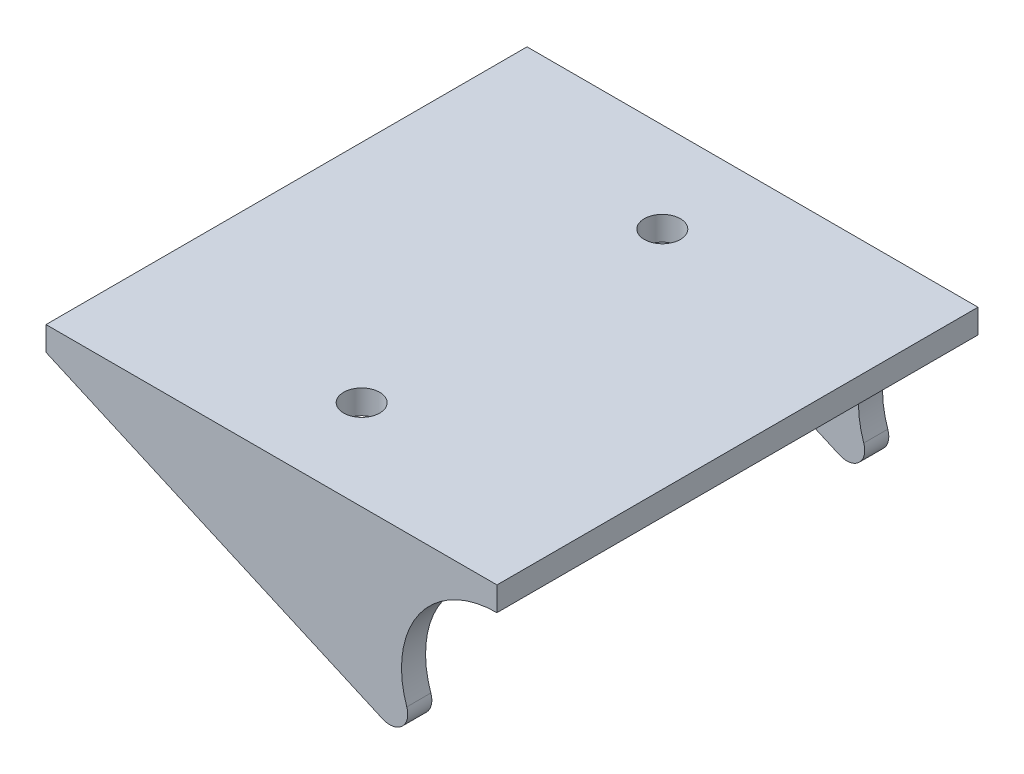
ISO-10303-21;
HEADER;
FILE_DESCRIPTION(('STEP AP214'),'2;1');
FILE_NAME('part.step','',(''),(''),'','','');
FILE_SCHEMA(('AUTOMOTIVE_DESIGN { 1 0 10303 214 1 1 1 1 }'));
ENDSEC;
DATA;
#1=APPLICATION_CONTEXT('core data for automotive mechanical design processes');
#2=APPLICATION_PROTOCOL_DEFINITION('international standard','automotive_design',2000,#1);
#3=PRODUCT_CONTEXT('',#1,'mechanical');
#4=PRODUCT('Part','Part','',(#3));
#5=PRODUCT_RELATED_PRODUCT_CATEGORY('part','',(#4));
#6=PRODUCT_DEFINITION_FORMATION('','',#4);
#7=PRODUCT_DEFINITION_CONTEXT('part definition',#1,'design');
#8=PRODUCT_DEFINITION('design','',#6,#7);
#9=PRODUCT_DEFINITION_SHAPE('','',#8);
#10=(LENGTH_UNIT() NAMED_UNIT(*) SI_UNIT(.MILLI.,.METRE.));
#11=(NAMED_UNIT(*) PLANE_ANGLE_UNIT() SI_UNIT($,.RADIAN.));
#12=(NAMED_UNIT(*) SI_UNIT($,.STERADIAN.) SOLID_ANGLE_UNIT());
#13=UNCERTAINTY_MEASURE_WITH_UNIT(LENGTH_MEASURE(1.E-05),#10,'distance_accuracy_value','');
#14=(GEOMETRIC_REPRESENTATION_CONTEXT(3) GLOBAL_UNCERTAINTY_ASSIGNED_CONTEXT((#13)) GLOBAL_UNIT_ASSIGNED_CONTEXT((#10,
#11,#12)) REPRESENTATION_CONTEXT('',''));
#15=CARTESIAN_POINT('',(0.,0.,0.));
#16=DIRECTION('',(0.,0.,1.));
#17=DIRECTION('',(1.,0.,0.));
#18=AXIS2_PLACEMENT_3D('',#15,#16,#17);
#19=CARTESIAN_POINT('',(0.,0.,4.));
#20=DIRECTION('',(0.,0.,-1.));
#21=DIRECTION('',(-1.,0.,0.));
#22=AXIS2_PLACEMENT_3D('',#19,#20,#21);
#23=CYLINDRICAL_SURFACE('',#22,15.875);
#24=CARTESIAN_POINT('',(0.,0.,4.));
#25=DIRECTION('',(0.,0.,-1.));
#26=DIRECTION('',(1.,0.,0.));
#27=AXIS2_PLACEMENT_3D('',#24,#25,#26);
#28=CIRCLE('',#27,15.875);
#29=CARTESIAN_POINT('',(-15.0004245130355,-5.1964304506771,4.));
#30=VERTEX_POINT('',#29);
#31=CARTESIAN_POINT('',(0.,15.875,4.));
#32=VERTEX_POINT('',#31);
#33=EDGE_CURVE('E169',#30,#32,#28,.T.);
#34=ORIENTED_EDGE('',*,*,#33,.F.);
#35=DIRECTION('',(0.,0.,-1.));
#36=VECTOR('',#35,1.);
#37=CARTESIAN_POINT('',(-15.0004245130355,-5.1964304506771,4.));
#38=LINE('',#37,#36);
#39=CARTESIAN_POINT('',(-15.0004245130355,-5.1964304506771,0.));
#40=VERTEX_POINT('',#39);
#41=EDGE_CURVE('E196',#30,#40,#38,.T.);
#42=ORIENTED_EDGE('',*,*,#41,.T.);
#43=CARTESIAN_POINT('',(0.,0.,0.));
#44=DIRECTION('',(0.,0.,-1.));
#45=DIRECTION('',(1.,0.,0.));
#46=AXIS2_PLACEMENT_3D('',#43,#44,#45);
#47=CIRCLE('',#46,15.875);
#48=CARTESIAN_POINT('',(0.,15.875,0.));
#49=VERTEX_POINT('',#48);
#50=EDGE_CURVE('E168',#40,#49,#47,.T.);
#51=ORIENTED_EDGE('',*,*,#50,.T.);
#52=DIRECTION('',(0.,0.,-1.));
#53=VECTOR('',#52,1.);
#54=CARTESIAN_POINT('',(0.,15.875,4.));
#55=LINE('',#54,#53);
#56=EDGE_CURVE('E184',#32,#49,#55,.T.);
#57=ORIENTED_EDGE('',*,*,#56,.F.);
#58=EDGE_LOOP('',(#34,#42,#51,#57));
#59=FACE_BOUND('',#58,.T.);
#60=ADVANCED_FACE('F33',(#59),#23,.F.);
#61=CARTESIAN_POINT('',(0.,15.875,4.));
#62=DIRECTION('',(-1.,0.,0.));
#63=DIRECTION('',(0.,0.,1.));
#64=AXIS2_PLACEMENT_3D('',#61,#62,#63);
#65=PLANE('',#64);
#66=DIRECTION('',(0.,1.,0.));
#67=VECTOR('',#66,1.);
#68=CARTESIAN_POINT('',(0.,15.875,0.));
#69=LINE('',#68,#67);
#70=CARTESIAN_POINT('',(0.,19.875,0.));
#71=VERTEX_POINT('',#70);
#72=EDGE_CURVE('E175',#49,#71,#69,.T.);
#73=ORIENTED_EDGE('',*,*,#72,.T.);
#74=DIRECTION('',(0.,0.,-1.));
#75=VECTOR('',#74,1.);
#76=CARTESIAN_POINT('',(0.,19.875,4.));
#77=LINE('',#76,#75);
#78=CARTESIAN_POINT('',(0.,19.875,80.));
#79=VERTEX_POINT('',#78);
#80=EDGE_CURVE('E120',#79,#71,#77,.T.);
#81=ORIENTED_EDGE('',*,*,#80,.F.);
#82=DIRECTION('',(0.,1.,0.));
#83=VECTOR('',#82,1.);
#84=CARTESIAN_POINT('',(0.,19.875,80.));
#85=LINE('',#84,#83);
#86=CARTESIAN_POINT('',(0.,15.875,80.));
#87=VERTEX_POINT('',#86);
#88=EDGE_CURVE('E136',#87,#79,#85,.T.);
#89=ORIENTED_EDGE('',*,*,#88,.F.);
#90=DIRECTION('',(0.,0.,-1.));
#91=VECTOR('',#90,1.);
#92=CARTESIAN_POINT('',(0.,15.875,80.));
#93=LINE('',#92,#91);
#94=CARTESIAN_POINT('',(0.,15.875,76.));
#95=VERTEX_POINT('',#94);
#96=EDGE_CURVE('E149',#87,#95,#93,.T.);
#97=ORIENTED_EDGE('',*,*,#96,.T.);
#98=DIRECTION('',(0.,0.,-1.));
#99=VECTOR('',#98,1.);
#100=CARTESIAN_POINT('',(0.,15.875,76.));
#101=LINE('',#100,#99);
#102=EDGE_CURVE('E160',#95,#32,#101,.T.);
#103=ORIENTED_EDGE('',*,*,#102,.T.);
#104=ORIENTED_EDGE('',*,*,#56,.T.);
#105=EDGE_LOOP('',(#73,#81,#89,#97,#103,#104));
#106=FACE_BOUND('',#105,.T.);
#107=ADVANCED_FACE('F208',(#106),#65,.F.);
#108=CARTESIAN_POINT('',(0.,19.875,4.));
#109=DIRECTION('',(0.,-1.,0.));
#110=DIRECTION('',(1.,0.,0.));
#111=AXIS2_PLACEMENT_3D('',#108,#109,#110);
#112=PLANE('',#111);
#113=CARTESIAN_POINT('',(-37.5,19.875,15.));
#114=DIRECTION('',(0.,1.,0.));
#115=DIRECTION('',(0.,0.,1.));
#116=AXIS2_PLACEMENT_3D('',#113,#114,#115);
#117=CIRCLE('',#116,2.99999999999999);
#118=CARTESIAN_POINT('',(-37.5,19.875,18.));
#119=VERTEX_POINT('',#118);
#120=EDGE_CURVE('E385',#119,#119,#117,.T.);
#121=ORIENTED_EDGE('',*,*,#120,.F.);
#122=EDGE_LOOP('',(#121));
#123=FACE_BOUND('',#122,.T.);
#124=CARTESIAN_POINT('',(-37.5,19.875,65.));
#125=DIRECTION('',(0.,1.,0.));
#126=DIRECTION('',(0.,0.,1.));
#127=AXIS2_PLACEMENT_3D('',#124,#125,#126);
#128=CIRCLE('',#127,3.);
#129=CARTESIAN_POINT('',(-37.5,19.875,68.));
#130=VERTEX_POINT('',#129);
#131=EDGE_CURVE('E142',#130,#130,#128,.T.);
#132=ORIENTED_EDGE('',*,*,#131,.F.);
#133=EDGE_LOOP('',(#132));
#134=FACE_BOUND('',#133,.T.);
#135=DIRECTION('',(-1.,0.,0.));
#136=VECTOR('',#135,1.);
#137=CARTESIAN_POINT('',(0.,19.875,0.));
#138=LINE('',#137,#136);
#139=CARTESIAN_POINT('',(-75.,19.875,0.));
#140=VERTEX_POINT('',#139);
#141=EDGE_CURVE('E117',#71,#140,#138,.T.);
#142=ORIENTED_EDGE('',*,*,#141,.T.);
#143=DIRECTION('',(0.,0.,-1.));
#144=VECTOR('',#143,1.);
#145=CARTESIAN_POINT('',(-75.,19.875,4.));
#146=LINE('',#145,#144);
#147=CARTESIAN_POINT('',(-75.,19.875,80.));
#148=VERTEX_POINT('',#147);
#149=EDGE_CURVE('E110',#148,#140,#146,.T.);
#150=ORIENTED_EDGE('',*,*,#149,.F.);
#151=DIRECTION('',(-1.,0.,0.));
#152=VECTOR('',#151,1.);
#153=CARTESIAN_POINT('',(-75.,19.875,80.));
#154=LINE('',#153,#152);
#155=EDGE_CURVE('E115',#79,#148,#154,.T.);
#156=ORIENTED_EDGE('',*,*,#155,.F.);
#157=ORIENTED_EDGE('',*,*,#80,.T.);
#158=EDGE_LOOP('',(#142,#150,#156,#157));
#159=FACE_BOUND('',#158,.T.);
#160=ADVANCED_FACE('F112',(#123,#134,#159),#112,.F.);
#161=CARTESIAN_POINT('',(-75.,19.875,4.));
#162=DIRECTION('',(1.,0.,0.));
#163=DIRECTION('',(0.,0.,-1.));
#164=AXIS2_PLACEMENT_3D('',#161,#162,#163);
#165=PLANE('',#164);
#166=DIRECTION('',(0.,-1.,0.));
#167=VECTOR('',#166,1.);
#168=CARTESIAN_POINT('',(-75.,19.875,0.));
#169=LINE('',#168,#167);
#170=CARTESIAN_POINT('',(-75.,15.875,0.));
#171=VERTEX_POINT('',#170);
#172=EDGE_CURVE('E178',#140,#171,#169,.T.);
#173=ORIENTED_EDGE('',*,*,#172,.T.);
#174=DIRECTION('',(0.,0.,-1.));
#175=VECTOR('',#174,1.);
#176=CARTESIAN_POINT('',(-75.,15.875,4.));
#177=LINE('',#176,#175);
#178=CARTESIAN_POINT('',(-75.,15.875,4.));
#179=VERTEX_POINT('',#178);
#180=EDGE_CURVE('E121',#179,#171,#177,.T.);
#181=ORIENTED_EDGE('',*,*,#180,.F.);
#182=DIRECTION('',(0.,0.,-1.));
#183=VECTOR('',#182,1.);
#184=CARTESIAN_POINT('',(-75.,15.875,76.));
#185=LINE('',#184,#183);
#186=CARTESIAN_POINT('',(-75.,15.875,76.));
#187=VERTEX_POINT('',#186);
#188=EDGE_CURVE('E165',#187,#179,#185,.T.);
#189=ORIENTED_EDGE('',*,*,#188,.F.);
#190=DIRECTION('',(0.,0.,-1.));
#191=VECTOR('',#190,1.);
#192=CARTESIAN_POINT('',(-75.,15.875,80.));
#193=LINE('',#192,#191);
#194=CARTESIAN_POINT('',(-75.,15.875,80.));
#195=VERTEX_POINT('',#194);
#196=EDGE_CURVE('E127',#195,#187,#193,.T.);
#197=ORIENTED_EDGE('',*,*,#196,.F.);
#198=DIRECTION('',(0.,-1.,0.));
#199=VECTOR('',#198,1.);
#200=CARTESIAN_POINT('',(-75.,19.875,80.));
#201=LINE('',#200,#199);
#202=EDGE_CURVE('E124',#148,#195,#201,.T.);
#203=ORIENTED_EDGE('',*,*,#202,.F.);
#204=ORIENTED_EDGE('',*,*,#149,.T.);
#205=EDGE_LOOP('',(#173,#181,#189,#197,#203,#204));
#206=FACE_BOUND('',#205,.T.);
#207=ADVANCED_FACE('F125',(#206),#165,.F.);
#208=CARTESIAN_POINT('',(-75.,15.875,4.));
#209=DIRECTION('',(0.405180137665535,0.914236870860795,0.));
#210=DIRECTION('',(-0.914236870860795,0.405180137665535,0.));
#211=AXIS2_PLACEMENT_3D('',#208,#209,#210);
#212=PLANE('',#211);
#213=DIRECTION('',(0.914236870860795,-0.405180137665535,0.));
#214=VECTOR('',#213,1.);
#215=CARTESIAN_POINT('',(-75.,15.875,0.));
#216=LINE('',#215,#214);
#217=CARTESIAN_POINT('',(-19.0506908182593,-8.92114366811185,0.));
#218=VERTEX_POINT('',#217);
#219=EDGE_CURVE('E172',#171,#218,#216,.T.);
#220=ORIENTED_EDGE('',*,*,#219,.T.);
#221=DIRECTION('',(0.,0.,-1.));
#222=VECTOR('',#221,1.);
#223=CARTESIAN_POINT('',(-19.0506908182593,-8.92114366811185,4.));
#224=LINE('',#223,#222);
#225=CARTESIAN_POINT('',(-19.0506908182593,-8.92114366811185,4.));
#226=VERTEX_POINT('',#225);
#227=EDGE_CURVE('E41',#218,#226,#224,.F.);
#228=ORIENTED_EDGE('',*,*,#227,.T.);
#229=DIRECTION('',(0.914236870860795,-0.405180137665535,0.));
#230=VECTOR('',#229,1.);
#231=CARTESIAN_POINT('',(-75.,15.875,4.));
#232=LINE('',#231,#230);
#233=EDGE_CURVE('E171',#179,#226,#232,.T.);
#234=ORIENTED_EDGE('',*,*,#233,.F.);
#235=ORIENTED_EDGE('',*,*,#180,.T.);
#236=EDGE_LOOP('',(#220,#228,#234,#235));
#237=FACE_BOUND('',#236,.T.);
#238=ADVANCED_FACE('F216',(#237),#212,.F.);
#239=CARTESIAN_POINT('',(0.,0.,4.));
#240=DIRECTION('',(0.,0.,1.));
#241=DIRECTION('',(1.,0.,0.));
#242=AXIS2_PLACEMENT_3D('',#239,#240,#241);
#243=PLANE('',#242);
#244=ORIENTED_EDGE('',*,*,#233,.T.);
#245=CARTESIAN_POINT('',(-17.8351504052627,-6.17843305552946,4.));
#246=DIRECTION('',(0.,0.,1.));
#247=DIRECTION('',(1.,0.,0.));
#248=AXIS2_PLACEMENT_3D('',#245,#246,#247);
#249=CIRCLE('',#248,3.);
#250=EDGE_CURVE('E11',#226,#30,#249,.T.);
#251=ORIENTED_EDGE('',*,*,#250,.T.);
#252=ORIENTED_EDGE('',*,*,#33,.T.);
#253=DIRECTION('',(1.,0.,0.));
#254=VECTOR('',#253,1.);
#255=CARTESIAN_POINT('',(0.,15.875,4.));
#256=LINE('',#255,#254);
#257=EDGE_CURVE('E156',#179,#32,#256,.T.);
#258=ORIENTED_EDGE('',*,*,#257,.F.);
#259=EDGE_LOOP('',(#244,#251,#252,#258));
#260=FACE_BOUND('',#259,.T.);
#261=ADVANCED_FACE('F215',(#260),#243,.T.);
#262=CARTESIAN_POINT('',(0.,0.,0.));
#263=DIRECTION('',(0.,0.,1.));
#264=DIRECTION('',(1.,0.,0.));
#265=AXIS2_PLACEMENT_3D('',#262,#263,#264);
#266=PLANE('',#265);
#267=ORIENTED_EDGE('',*,*,#50,.F.);
#268=CARTESIAN_POINT('',(-17.8351504052627,-6.17843305552946,0.));
#269=DIRECTION('',(0.,0.,1.));
#270=DIRECTION('',(1.,0.,0.));
#271=AXIS2_PLACEMENT_3D('',#268,#269,#270);
#272=CIRCLE('',#271,3.);
#273=EDGE_CURVE('E55',#40,#218,#272,.F.);
#274=ORIENTED_EDGE('',*,*,#273,.T.);
#275=ORIENTED_EDGE('',*,*,#219,.F.);
#276=ORIENTED_EDGE('',*,*,#172,.F.);
#277=ORIENTED_EDGE('',*,*,#141,.F.);
#278=ORIENTED_EDGE('',*,*,#72,.F.);
#279=EDGE_LOOP('',(#267,#274,#275,#276,#277,#278));
#280=FACE_BOUND('',#279,.T.);
#281=ADVANCED_FACE('F206',(#280),#266,.F.);
#282=CARTESIAN_POINT('',(0.,15.875,76.));
#283=DIRECTION('',(0.,1.,0.));
#284=DIRECTION('',(-1.,0.,0.));
#285=AXIS2_PLACEMENT_3D('',#282,#283,#284);
#286=PLANE('',#285);
#287=CARTESIAN_POINT('',(-37.5,15.875,15.));
#288=DIRECTION('',(0.,1.,0.));
#289=DIRECTION('',(0.,0.,1.));
#290=AXIS2_PLACEMENT_3D('',#287,#288,#289);
#291=CIRCLE('',#290,2.99999999999999);
#292=CARTESIAN_POINT('',(-37.5,15.875,18.));
#293=VERTEX_POINT('',#292);
#294=EDGE_CURVE('E151',#293,#293,#291,.T.);
#295=ORIENTED_EDGE('',*,*,#294,.T.);
#296=EDGE_LOOP('',(#295));
#297=FACE_BOUND('',#296,.T.);
#298=CARTESIAN_POINT('',(-37.5,15.875,65.));
#299=DIRECTION('',(0.,1.,0.));
#300=DIRECTION('',(0.,0.,1.));
#301=AXIS2_PLACEMENT_3D('',#298,#299,#300);
#302=CIRCLE('',#301,3.);
#303=CARTESIAN_POINT('',(-37.5,15.875,68.));
#304=VERTEX_POINT('',#303);
#305=EDGE_CURVE('E389',#304,#304,#302,.T.);
#306=ORIENTED_EDGE('',*,*,#305,.T.);
#307=EDGE_LOOP('',(#306));
#308=FACE_BOUND('',#307,.T.);
#309=ORIENTED_EDGE('',*,*,#257,.T.);
#310=ORIENTED_EDGE('',*,*,#102,.F.);
#311=DIRECTION('',(1.,0.,0.));
#312=VECTOR('',#311,1.);
#313=CARTESIAN_POINT('',(0.,15.875,76.));
#314=LINE('',#313,#312);
#315=EDGE_CURVE('E157',#187,#95,#314,.T.);
#316=ORIENTED_EDGE('',*,*,#315,.F.);
#317=ORIENTED_EDGE('',*,*,#188,.T.);
#318=EDGE_LOOP('',(#309,#310,#316,#317));
#319=FACE_BOUND('',#318,.T.);
#320=ADVANCED_FACE('F211',(#297,#308,#319),#286,.F.);
#321=CARTESIAN_POINT('',(-75.,15.875,80.));
#322=DIRECTION('',(0.405180137665535,0.914236870860795,0.));
#323=DIRECTION('',(-0.914236870860795,0.405180137665535,0.));
#324=AXIS2_PLACEMENT_3D('',#321,#322,#323);
#325=PLANE('',#324);
#326=DIRECTION('',(0.914236870860795,-0.405180137665535,0.));
#327=VECTOR('',#326,1.);
#328=CARTESIAN_POINT('',(-75.,15.875,76.));
#329=LINE('',#328,#327);
#330=CARTESIAN_POINT('',(-19.0506908182593,-8.92114366811184,76.));
#331=VERTEX_POINT('',#330);
#332=EDGE_CURVE('E139',#187,#331,#329,.T.);
#333=ORIENTED_EDGE('',*,*,#332,.T.);
#334=DIRECTION('',(0.,0.,-1.));
#335=VECTOR('',#334,1.);
#336=CARTESIAN_POINT('',(-19.0506908182593,-8.92114366811184,80.));
#337=LINE('',#336,#335);
#338=CARTESIAN_POINT('',(-19.0506908182593,-8.92114366811184,80.));
#339=VERTEX_POINT('',#338);
#340=EDGE_CURVE('E192',#331,#339,#337,.F.);
#341=ORIENTED_EDGE('',*,*,#340,.T.);
#342=DIRECTION('',(0.914236870860795,-0.405180137665535,0.));
#343=VECTOR('',#342,1.);
#344=CARTESIAN_POINT('',(-75.,15.875,80.));
#345=LINE('',#344,#343);
#346=EDGE_CURVE('E131',#195,#339,#345,.T.);
#347=ORIENTED_EDGE('',*,*,#346,.F.);
#348=ORIENTED_EDGE('',*,*,#196,.T.);
#349=EDGE_LOOP('',(#333,#341,#347,#348));
#350=FACE_BOUND('',#349,.T.);
#351=ADVANCED_FACE('F256',(#350),#325,.F.);
#352=CARTESIAN_POINT('',(0.,0.,80.));
#353=DIRECTION('',(0.,0.,-1.));
#354=DIRECTION('',(-1.,0.,0.));
#355=AXIS2_PLACEMENT_3D('',#352,#353,#354);
#356=CYLINDRICAL_SURFACE('',#355,15.875);
#357=CARTESIAN_POINT('',(0.,0.,80.));
#358=DIRECTION('',(0.,0.,-1.));
#359=DIRECTION('',(-1.,0.,0.));
#360=AXIS2_PLACEMENT_3D('',#357,#358,#359);
#361=CIRCLE('',#360,15.875);
#362=CARTESIAN_POINT('',(-15.0004245130355,-5.19643045067709,80.));
#363=VERTEX_POINT('',#362);
#364=EDGE_CURVE('E146',#363,#87,#361,.T.);
#365=ORIENTED_EDGE('',*,*,#364,.F.);
#366=DIRECTION('',(0.,0.,-1.));
#367=VECTOR('',#366,1.);
#368=CARTESIAN_POINT('',(-15.0004245130355,-5.19643045067709,80.));
#369=LINE('',#368,#367);
#370=CARTESIAN_POINT('',(-15.0004245130355,-5.19643045067709,76.));
#371=VERTEX_POINT('',#370);
#372=EDGE_CURVE('E187',#363,#371,#369,.T.);
#373=ORIENTED_EDGE('',*,*,#372,.T.);
#374=CARTESIAN_POINT('',(0.,0.,76.));
#375=DIRECTION('',(0.,0.,-1.));
#376=DIRECTION('',(-1.,0.,0.));
#377=AXIS2_PLACEMENT_3D('',#374,#375,#376);
#378=CIRCLE('',#377,15.875);
#379=EDGE_CURVE('E137',#371,#95,#378,.T.);
#380=ORIENTED_EDGE('',*,*,#379,.T.);
#381=ORIENTED_EDGE('',*,*,#96,.F.);
#382=EDGE_LOOP('',(#365,#373,#380,#381));
#383=FACE_BOUND('',#382,.T.);
#384=ADVANCED_FACE('F250',(#383),#356,.F.);
#385=CARTESIAN_POINT('',(0.,0.,80.));
#386=DIRECTION('',(0.,0.,-1.));
#387=DIRECTION('',(-1.,0.,0.));
#388=AXIS2_PLACEMENT_3D('',#385,#386,#387);
#389=PLANE('',#388);
#390=ORIENTED_EDGE('',*,*,#346,.T.);
#391=CARTESIAN_POINT('',(-17.8351504052627,-6.17843305552945,80.));
#392=DIRECTION('',(0.,0.,-1.));
#393=DIRECTION('',(-1.,0.,0.));
#394=AXIS2_PLACEMENT_3D('',#391,#392,#393);
#395=CIRCLE('',#394,3.);
#396=EDGE_CURVE('E194',#339,#363,#395,.F.);
#397=ORIENTED_EDGE('',*,*,#396,.T.);
#398=ORIENTED_EDGE('',*,*,#364,.T.);
#399=ORIENTED_EDGE('',*,*,#88,.T.);
#400=ORIENTED_EDGE('',*,*,#155,.T.);
#401=ORIENTED_EDGE('',*,*,#202,.T.);
#402=EDGE_LOOP('',(#390,#397,#398,#399,#400,#401));
#403=FACE_BOUND('',#402,.T.);
#404=ADVANCED_FACE('F134',(#403),#389,.F.);
#405=CARTESIAN_POINT('',(0.,0.,76.));
#406=DIRECTION('',(0.,0.,-1.));
#407=DIRECTION('',(-1.,0.,0.));
#408=AXIS2_PLACEMENT_3D('',#405,#406,#407);
#409=PLANE('',#408);
#410=ORIENTED_EDGE('',*,*,#379,.F.);
#411=CARTESIAN_POINT('',(-17.8351504052627,-6.17843305552945,76.));
#412=DIRECTION('',(0.,0.,-1.));
#413=DIRECTION('',(-1.,0.,0.));
#414=AXIS2_PLACEMENT_3D('',#411,#412,#413);
#415=CIRCLE('',#414,3.);
#416=EDGE_CURVE('E190',#371,#331,#415,.T.);
#417=ORIENTED_EDGE('',*,*,#416,.T.);
#418=ORIENTED_EDGE('',*,*,#332,.F.);
#419=ORIENTED_EDGE('',*,*,#315,.T.);
#420=EDGE_LOOP('',(#410,#417,#418,#419));
#421=FACE_BOUND('',#420,.T.);
#422=ADVANCED_FACE('F253',(#421),#409,.T.);
#423=CARTESIAN_POINT('',(-37.5,15.875,65.));
#424=DIRECTION('',(0.,1.,0.));
#425=DIRECTION('',(0.,0.,1.));
#426=AXIS2_PLACEMENT_3D('',#423,#424,#425);
#427=CYLINDRICAL_SURFACE('',#426,3.);
#428=ORIENTED_EDGE('',*,*,#305,.F.);
#429=EDGE_LOOP('',(#428));
#430=FACE_BOUND('',#429,.T.);
#431=ORIENTED_EDGE('',*,*,#131,.T.);
#432=EDGE_LOOP('',(#431));
#433=FACE_BOUND('',#432,.T.);
#434=ADVANCED_FACE('F241',(#430,#433),#427,.F.);
#435=CARTESIAN_POINT('',(-37.5,15.875,15.));
#436=DIRECTION('',(0.,1.,0.));
#437=DIRECTION('',(0.,0.,1.));
#438=AXIS2_PLACEMENT_3D('',#435,#436,#437);
#439=CYLINDRICAL_SURFACE('',#438,2.99999999999999);
#440=ORIENTED_EDGE('',*,*,#294,.F.);
#441=EDGE_LOOP('',(#440));
#442=FACE_BOUND('',#441,.T.);
#443=ORIENTED_EDGE('',*,*,#120,.T.);
#444=EDGE_LOOP('',(#443));
#445=FACE_BOUND('',#444,.T.);
#446=ADVANCED_FACE('F235',(#442,#445),#439,.F.);
#447=CARTESIAN_POINT('',(-17.8351504052627,-6.17843305552945,80.));
#448=DIRECTION('',(0.,0.,-1.));
#449=DIRECTION('',(-1.,0.,0.));
#450=AXIS2_PLACEMENT_3D('',#447,#448,#449);
#451=CYLINDRICAL_SURFACE('',#450,3.);
#452=ORIENTED_EDGE('',*,*,#396,.F.);
#453=ORIENTED_EDGE('',*,*,#340,.F.);
#454=ORIENTED_EDGE('',*,*,#416,.F.);
#455=ORIENTED_EDGE('',*,*,#372,.F.);
#456=EDGE_LOOP('',(#452,#453,#454,#455));
#457=FACE_BOUND('',#456,.T.);
#458=ADVANCED_FACE('F233',(#457),#451,.T.);
#459=CARTESIAN_POINT('',(-17.8351504052627,-6.17843305552946,4.));
#460=DIRECTION('',(0.,0.,-1.));
#461=DIRECTION('',(-1.,0.,0.));
#462=AXIS2_PLACEMENT_3D('',#459,#460,#461);
#463=CYLINDRICAL_SURFACE('',#462,3.);
#464=ORIENTED_EDGE('',*,*,#250,.F.);
#465=ORIENTED_EDGE('',*,*,#227,.F.);
#466=ORIENTED_EDGE('',*,*,#273,.F.);
#467=ORIENTED_EDGE('',*,*,#41,.F.);
#468=EDGE_LOOP('',(#464,#465,#466,#467));
#469=FACE_BOUND('',#468,.T.);
#470=ADVANCED_FACE('F35',(#469),#463,.T.);
#471=CLOSED_SHELL('',(#60,#107,#160,#207,#238,#261,#281,#320,#351,#384,#404,#422,#434,#446,#458,#470));
#472=MANIFOLD_SOLID_BREP('B2',#471);
#473=ADVANCED_BREP_SHAPE_REPRESENTATION('',(#18,#472),#14);
#474=SHAPE_DEFINITION_REPRESENTATION(#9,#473);
ENDSEC;
END-ISO-10303-21;
